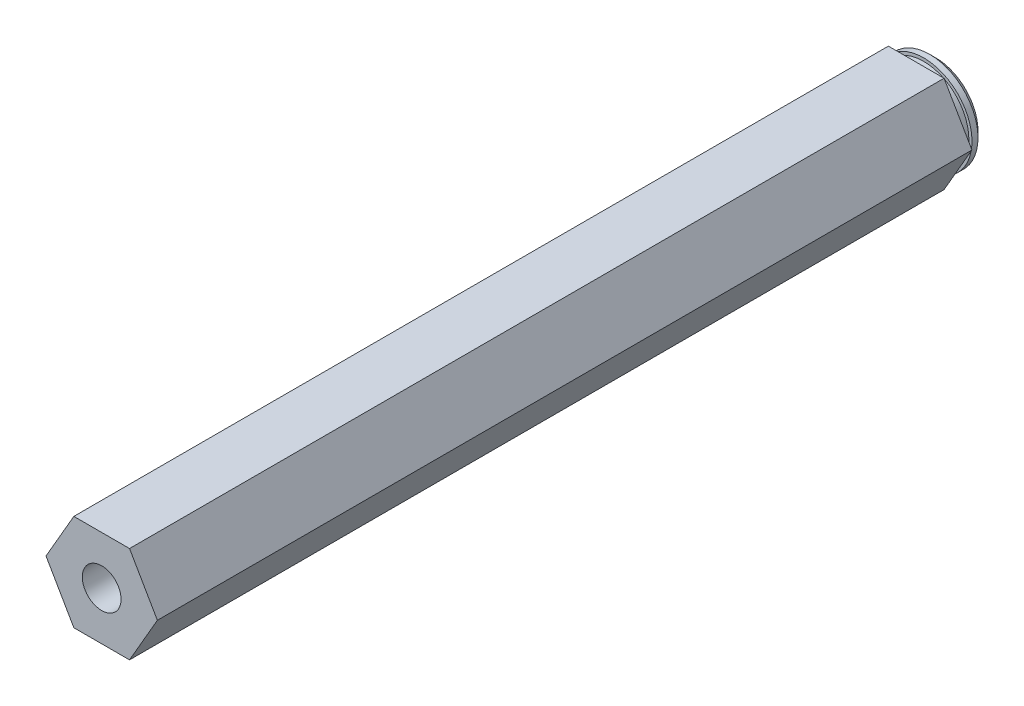
ISO-10303-21;
HEADER;
FILE_DESCRIPTION(('STEP AP214'),'2;1');
FILE_NAME('part.step','',(''),(''),'','','');
FILE_SCHEMA(('AUTOMOTIVE_DESIGN { 1 0 10303 214 1 1 1 1 }'));
ENDSEC;
DATA;
#1=APPLICATION_CONTEXT('core data for automotive mechanical design processes');
#2=APPLICATION_PROTOCOL_DEFINITION('international standard','automotive_design',2000,#1);
#3=PRODUCT_CONTEXT('',#1,'mechanical');
#4=PRODUCT('Part','Part','',(#3));
#5=PRODUCT_RELATED_PRODUCT_CATEGORY('part','',(#4));
#6=PRODUCT_DEFINITION_FORMATION('','',#4);
#7=PRODUCT_DEFINITION_CONTEXT('part definition',#1,'design');
#8=PRODUCT_DEFINITION('design','',#6,#7);
#9=PRODUCT_DEFINITION_SHAPE('','',#8);
#10=(LENGTH_UNIT() NAMED_UNIT(*) SI_UNIT(.MILLI.,.METRE.));
#11=(NAMED_UNIT(*) PLANE_ANGLE_UNIT() SI_UNIT($,.RADIAN.));
#12=(NAMED_UNIT(*) SI_UNIT($,.STERADIAN.) SOLID_ANGLE_UNIT());
#13=UNCERTAINTY_MEASURE_WITH_UNIT(LENGTH_MEASURE(1.E-05),#10,'distance_accuracy_value','');
#14=(GEOMETRIC_REPRESENTATION_CONTEXT(3) GLOBAL_UNCERTAINTY_ASSIGNED_CONTEXT((#13)) GLOBAL_UNIT_ASSIGNED_CONTEXT((#10,
#11,#12)) REPRESENTATION_CONTEXT('',''));
#15=CARTESIAN_POINT('',(0.,0.,0.));
#16=DIRECTION('',(0.,0.,1.));
#17=DIRECTION('',(1.,0.,0.));
#18=AXIS2_PLACEMENT_3D('',#15,#16,#17);
#19=CARTESIAN_POINT('',(0.,0.,-38.1000000000427));
#20=DIRECTION('',(0.,0.,-1.));
#21=DIRECTION('',(-1.,0.,0.));
#22=AXIS2_PLACEMENT_3D('',#19,#20,#21);
#23=CONICAL_SURFACE('',#22,3.1877000000691,1.02974425866953);
#24=CARTESIAN_POINT('',(0.,0.,-36.1846366047303));
#25=VERTEX_POINT('',#24);
#26=VERTEX_LOOP('',#25);
#27=FACE_BOUND('',#26,.T.);
#28=CARTESIAN_POINT('',(-1.66004709978296E-13,1.11022302462516E-13,-38.0999999999994));
#29=DIRECTION('',(0.,0.,-1.));
#30=DIRECTION('',(-1.,0.,0.));
#31=AXIS2_PLACEMENT_3D('',#28,#29,#30);
#32=CIRCLE('',#31,3.18769999999998);
#33=CARTESIAN_POINT('',(-3.18770000000015,1.11022302462516E-13,-38.0999999999994));
#34=VERTEX_POINT('',#33);
#35=EDGE_CURVE('E77',#34,#34,#32,.T.);
#36=ORIENTED_EDGE('',*,*,#35,.T.);
#37=EDGE_LOOP('',(#36));
#38=FACE_BOUND('',#37,.T.);
#39=ADVANCED_FACE('F17',(#27,#38),#23,.F.);
#40=CARTESIAN_POINT('',(-1.66533453693773E-13,1.11022302462516E-13,-63.4999999999992));
#41=DIRECTION('',(0.,0.,-1.));
#42=DIRECTION('',(-1.,0.,0.));
#43=AXIS2_PLACEMENT_3D('',#40,#41,#42);
#44=CYLINDRICAL_SURFACE('',#43,3.18769999999998);
#45=ORIENTED_EDGE('',*,*,#35,.F.);
#46=EDGE_LOOP('',(#45));
#47=FACE_BOUND('',#46,.T.);
#48=CARTESIAN_POINT('',(-1.66533453693773E-13,1.11022302462516E-13,-63.4999999999992));
#49=DIRECTION('',(0.,0.,-1.));
#50=DIRECTION('',(-1.,0.,0.));
#51=AXIS2_PLACEMENT_3D('',#48,#49,#50);
#52=CIRCLE('',#51,3.18769999999998);
#53=CARTESIAN_POINT('',(-3.18770000000015,1.11022302462516E-13,-63.4999999999992));
#54=VERTEX_POINT('',#53);
#55=EDGE_CURVE('E20',#54,#54,#52,.T.);
#56=ORIENTED_EDGE('',*,*,#55,.T.);
#57=EDGE_LOOP('',(#56));
#58=FACE_BOUND('',#57,.T.);
#59=ADVANCED_FACE('F74',(#47,#58),#44,.F.);
#60=CARTESIAN_POINT('',(-1.66533453693773E-13,1.11022302462516E-13,-63.4999999999992));
#61=DIRECTION('',(0.,0.,1.));
#62=DIRECTION('',(1.,0.,0.));
#63=AXIS2_PLACEMENT_3D('',#60,#61,#62);
#64=PLANE('',#63);
#65=ORIENTED_EDGE('',*,*,#55,.F.);
#66=EDGE_LOOP('',(#65));
#67=FACE_BOUND('',#66,.T.);
#68=CARTESIAN_POINT('',(-1.66533453693773E-13,1.11022302462516E-13,-63.4999999999764));
#69=DIRECTION('',(0.,0.,1.));
#70=DIRECTION('',(1.,0.,0.));
#71=AXIS2_PLACEMENT_3D('',#68,#69,#70);
#72=CIRCLE('',#71,5.55624999998389);
#73=CARTESIAN_POINT('',(5.55624999998372,1.11022302462516E-13,-63.4999999999764));
#74=VERTEX_POINT('',#73);
#75=EDGE_CURVE('E81',#74,#74,#72,.T.);
#76=ORIENTED_EDGE('',*,*,#75,.F.);
#77=EDGE_LOOP('',(#76));
#78=FACE_BOUND('',#77,.T.);
#79=ADVANCED_FACE('F113',(#67,#78),#64,.F.);
#80=CARTESIAN_POINT('',(-1.66533453693773E-13,1.11022302462516E-13,-62.7062500000761));
#81=DIRECTION('',(0.,0.,1.));
#82=DIRECTION('',(1.,0.,0.));
#83=AXIS2_PLACEMENT_3D('',#80,#81,#82);
#84=CONICAL_SURFACE('',#83,6.34999999994096,0.785398163433255);
#85=CARTESIAN_POINT('',(-1.11059446708528E-13,0.,-62.7062499999992));
#86=DIRECTION('',(0.,0.,-1.));
#87=DIRECTION('',(-1.,0.,0.));
#88=AXIS2_PLACEMENT_3D('',#85,#86,#87);
#89=CIRCLE('',#88,6.34999999999997);
#90=CARTESIAN_POINT('',(-6.35000000000008,0.,-62.7062499999992));
#91=VERTEX_POINT('',#90);
#92=EDGE_CURVE('E84',#91,#91,#89,.F.);
#93=ORIENTED_EDGE('',*,*,#92,.F.);
#94=EDGE_LOOP('',(#93));
#95=FACE_BOUND('',#94,.T.);
#96=ORIENTED_EDGE('',*,*,#75,.T.);
#97=EDGE_LOOP('',(#96));
#98=FACE_BOUND('',#97,.T.);
#99=ADVANCED_FACE('F111',(#95,#98),#84,.T.);
#100=CARTESIAN_POINT('',(-1.11022302462516E-13,0.,-60.9218999999992));
#101=DIRECTION('',(0.,0.,-1.));
#102=DIRECTION('',(-1.,0.,0.));
#103=AXIS2_PLACEMENT_3D('',#100,#101,#102);
#104=CYLINDRICAL_SURFACE('',#103,6.34999999999997);
#105=ORIENTED_EDGE('',*,*,#92,.T.);
#106=EDGE_LOOP('',(#105));
#107=FACE_BOUND('',#106,.T.);
#108=CARTESIAN_POINT('',(-1.11042923467419E-13,0.,-61.9124999999991));
#109=DIRECTION('',(0.,0.,-1.));
#110=DIRECTION('',(-1.,0.,0.));
#111=AXIS2_PLACEMENT_3D('',#108,#109,#110);
#112=CIRCLE('',#111,6.34999999999997);
#113=CARTESIAN_POINT('',(-6.35000000000008,0.,-61.9124999999991));
#114=VERTEX_POINT('',#113);
#115=EDGE_CURVE('E100',#114,#114,#112,.F.);
#116=ORIENTED_EDGE('',*,*,#115,.F.);
#117=EDGE_LOOP('',(#116));
#118=FACE_BOUND('',#117,.T.);
#119=ADVANCED_FACE('F108',(#107,#118),#104,.T.);
#120=CARTESIAN_POINT('',(0.,6.34999999999997,-61.9124999999992));
#121=DIRECTION('',(0.,0.,1.));
#122=DIRECTION('',(1.,0.,0.));
#123=AXIS2_PLACEMENT_3D('',#120,#121,#122);
#124=PLANE('',#123);
#125=CARTESIAN_POINT('',(0.,0.,-61.9124999999991));
#126=DIRECTION('',(0.,0.,1.));
#127=DIRECTION('',(1.,0.,0.));
#128=AXIS2_PLACEMENT_3D('',#125,#126,#127);
#129=CIRCLE('',#128,5.94359999999998);
#130=CARTESIAN_POINT('',(5.94359999999997,0.,-61.9124999999991));
#131=VERTEX_POINT('',#130);
#132=EDGE_CURVE('E96',#131,#131,#129,.T.);
#133=ORIENTED_EDGE('',*,*,#132,.F.);
#134=EDGE_LOOP('',(#133));
#135=FACE_BOUND('',#134,.T.);
#136=ORIENTED_EDGE('',*,*,#115,.T.);
#137=EDGE_LOOP('',(#136));
#138=FACE_BOUND('',#137,.T.);
#139=ADVANCED_FACE('F120',(#135,#138),#124,.T.);
#140=CARTESIAN_POINT('',(0.,0.,0.));
#141=DIRECTION('',(0.,0.,1.));
#142=DIRECTION('',(1.,0.,0.));
#143=AXIS2_PLACEMENT_3D('',#140,#141,#142);
#144=CONICAL_SURFACE('',#143,2.55270000002383,1.02974425868774);
#145=CARTESIAN_POINT('',(0.,0.,-1.53381690216747));
#146=VERTEX_POINT('',#145);
#147=VERTEX_LOOP('',#146);
#148=FACE_BOUND('',#147,.T.);
#149=CARTESIAN_POINT('',(0.,-1.38777878078145E-13,0.));
#150=DIRECTION('',(0.,0.,1.));
#151=DIRECTION('',(1.,0.,0.));
#152=AXIS2_PLACEMENT_3D('',#149,#150,#151);
#153=CIRCLE('',#152,2.55269999999998);
#154=CARTESIAN_POINT('',(2.55270000000006,-1.38777878078145E-13,0.));
#155=VERTEX_POINT('',#154);
#156=EDGE_CURVE('E99',#155,#155,#153,.T.);
#157=ORIENTED_EDGE('',*,*,#156,.T.);
#158=EDGE_LOOP('',(#157));
#159=FACE_BOUND('',#158,.T.);
#160=ADVANCED_FACE('F166',(#148,#159),#144,.F.);
#161=CARTESIAN_POINT('',(0.,0.,0.));
#162=DIRECTION('',(0.,0.,1.));
#163=DIRECTION('',(1.,0.,0.));
#164=AXIS2_PLACEMENT_3D('',#161,#162,#163);
#165=CYLINDRICAL_SURFACE('',#164,5.94359999999998);
#166=ORIENTED_EDGE('',*,*,#132,.T.);
#167=EDGE_LOOP('',(#166));
#168=FACE_BOUND('',#167,.T.);
#169=CARTESIAN_POINT('',(0.,0.,-60.9218999999992));
#170=DIRECTION('',(0.,0.,1.));
#171=DIRECTION('',(1.,0.,0.));
#172=AXIS2_PLACEMENT_3D('',#169,#170,#171);
#173=CIRCLE('',#172,5.94359999999998);
#174=CARTESIAN_POINT('',(5.94359999999997,0.,-60.9218999999992));
#175=VERTEX_POINT('',#174);
#176=EDGE_CURVE('E91',#175,#175,#173,.T.);
#177=ORIENTED_EDGE('',*,*,#176,.F.);
#178=EDGE_LOOP('',(#177));
#179=FACE_BOUND('',#178,.T.);
#180=ADVANCED_FACE('F162',(#168,#179),#165,.T.);
#181=CARTESIAN_POINT('',(0.,-1.38777878078145E-13,63.4999999999999));
#182=DIRECTION('',(0.,0.,1.));
#183=DIRECTION('',(1.,0.,0.));
#184=AXIS2_PLACEMENT_3D('',#181,#182,#183);
#185=CYLINDRICAL_SURFACE('',#184,2.55269999999998);
#186=ORIENTED_EDGE('',*,*,#156,.F.);
#187=EDGE_LOOP('',(#186));
#188=FACE_BOUND('',#187,.T.);
#189=CARTESIAN_POINT('',(0.,-1.38777878078145E-13,46.3296));
#190=DIRECTION('',(0.,0.,1.));
#191=DIRECTION('',(1.,0.,0.));
#192=AXIS2_PLACEMENT_3D('',#189,#190,#191);
#193=CIRCLE('',#192,2.55269999999998);
#194=CARTESIAN_POINT('',(2.55270000000007,-1.38777878078145E-13,46.3296));
#195=VERTEX_POINT('',#194);
#196=EDGE_CURVE('E86',#195,#195,#193,.F.);
#197=ORIENTED_EDGE('',*,*,#196,.F.);
#198=EDGE_LOOP('',(#197));
#199=FACE_BOUND('',#198,.T.);
#200=ADVANCED_FACE('F158',(#188,#199),#185,.F.);
#201=CARTESIAN_POINT('',(7.33234841870831,-1.11022302462516E-13,63.5));
#202=DIRECTION('',(-0.866025403784439,-0.499999999999999,0.));
#203=DIRECTION('',(0.499999999999999,-0.866025403784439,0.));
#204=AXIS2_PLACEMENT_3D('',#201,#202,#203);
#205=PLANE('',#204);
#206=DIRECTION('',(0.,0.,1.));
#207=VECTOR('',#206,1.);
#208=CARTESIAN_POINT('',(7.33234841870825,0.,63.5));
#209=LINE('',#208,#207);
#210=CARTESIAN_POINT('',(7.33234841870824,0.,46.3295999999999));
#211=VERTEX_POINT('',#210);
#212=CARTESIAN_POINT('',(7.33234841870825,0.,-60.9218999999992));
#213=VERTEX_POINT('',#212);
#214=EDGE_CURVE('E201',#211,#213,#209,.F.);
#215=ORIENTED_EDGE('',*,*,#214,.T.);
#216=DIRECTION('',(0.499999999999991,-0.866025403784444,0.));
#217=VECTOR('',#216,1.);
#218=CARTESIAN_POINT('',(3.66617420935425,6.34999999999994,-60.9218999999992));
#219=LINE('',#218,#217);
#220=CARTESIAN_POINT('',(3.66617420935422,6.34999999999991,-60.9218999999992));
#221=VERTEX_POINT('',#220);
#222=EDGE_CURVE('E197',#221,#213,#219,.T.);
#223=ORIENTED_EDGE('',*,*,#222,.F.);
#224=DIRECTION('',(0.,0.,1.));
#225=VECTOR('',#224,1.);
#226=CARTESIAN_POINT('',(3.66617420935425,6.34999999999986,63.4999999999999));
#227=LINE('',#226,#225);
#228=CARTESIAN_POINT('',(3.66617420935423,6.34999999999994,46.3295999999999));
#229=VERTEX_POINT('',#228);
#230=EDGE_CURVE('E207',#221,#229,#227,.T.);
#231=ORIENTED_EDGE('',*,*,#230,.T.);
#232=DIRECTION('',(-0.499999999999976,0.866025403784452,0.));
#233=VECTOR('',#232,1.);
#234=CARTESIAN_POINT('',(7.33234841870822,0.,46.3296));
#235=LINE('',#234,#233);
#236=EDGE_CURVE('E218',#211,#229,#235,.T.);
#237=ORIENTED_EDGE('',*,*,#236,.F.);
#238=EDGE_LOOP('',(#215,#223,#231,#237));
#239=FACE_BOUND('',#238,.T.);
#240=ADVANCED_FACE('F154',(#239),#205,.F.);
#241=CARTESIAN_POINT('',(3.66617420935418,6.34999999999986,63.4999999999999));
#242=DIRECTION('',(0.,-1.,0.));
#243=DIRECTION('',(1.,0.,0.));
#244=AXIS2_PLACEMENT_3D('',#241,#242,#243);
#245=PLANE('',#244);
#246=ORIENTED_EDGE('',*,*,#230,.F.);
#247=DIRECTION('',(-1.,0.,0.));
#248=VECTOR('',#247,1.);
#249=CARTESIAN_POINT('',(-1.11022302462516E-13,6.34999999999999,-60.9218999999992));
#250=LINE('',#249,#248);
#251=CARTESIAN_POINT('',(-3.66617420935413,6.34999999999992,-60.9218999999992));
#252=VERTEX_POINT('',#251);
#253=EDGE_CURVE('E199',#252,#221,#250,.F.);
#254=ORIENTED_EDGE('',*,*,#253,.F.);
#255=DIRECTION('',(0.,0.,1.));
#256=VECTOR('',#255,1.);
#257=CARTESIAN_POINT('',(-3.66617420935409,6.34999999999997,63.4999999999999));
#258=LINE('',#257,#256);
#259=CARTESIAN_POINT('',(-3.66617420935413,6.34999999999993,46.3295999999999));
#260=VERTEX_POINT('',#259);
#261=EDGE_CURVE('E204',#252,#260,#258,.T.);
#262=ORIENTED_EDGE('',*,*,#261,.T.);
#263=DIRECTION('',(1.,0.,0.));
#264=VECTOR('',#263,1.);
#265=CARTESIAN_POINT('',(0.,6.35000000000002,46.3296));
#266=LINE('',#265,#264);
#267=EDGE_CURVE('E219',#229,#260,#266,.F.);
#268=ORIENTED_EDGE('',*,*,#267,.F.);
#269=EDGE_LOOP('',(#246,#254,#262,#268));
#270=FACE_BOUND('',#269,.T.);
#271=ADVANCED_FACE('F150',(#270),#245,.F.);
#272=CARTESIAN_POINT('',(-3.66617420935414,6.34999999999988,63.4999999999999));
#273=DIRECTION('',(0.866025403784439,-0.499999999999999,0.));
#274=DIRECTION('',(0.499999999999999,0.866025403784439,0.));
#275=AXIS2_PLACEMENT_3D('',#272,#273,#274);
#276=PLANE('',#275);
#277=ORIENTED_EDGE('',*,*,#261,.F.);
#278=DIRECTION('',(0.500000000000012,0.866025403784432,0.));
#279=VECTOR('',#278,1.);
#280=CARTESIAN_POINT('',(-7.33234841870839,0.,-60.9218999999992));
#281=LINE('',#280,#279);
#282=CARTESIAN_POINT('',(-7.33234841870833,0.,-60.9218999999992));
#283=VERTEX_POINT('',#282);
#284=EDGE_CURVE('E95',#283,#252,#281,.T.);
#285=ORIENTED_EDGE('',*,*,#284,.F.);
#286=DIRECTION('',(0.,0.,1.));
#287=VECTOR('',#286,1.);
#288=CARTESIAN_POINT('',(-7.33234841870833,0.,63.5));
#289=LINE('',#288,#287);
#290=CARTESIAN_POINT('',(-7.33234841870826,0.,46.3295999999999));
#291=VERTEX_POINT('',#290);
#292=EDGE_CURVE('E90',#283,#291,#289,.T.);
#293=ORIENTED_EDGE('',*,*,#292,.T.);
#294=DIRECTION('',(-0.499999999999999,-0.866025403784439,0.));
#295=VECTOR('',#294,1.);
#296=CARTESIAN_POINT('',(-3.66617420935414,6.35000000000005,46.3296));
#297=LINE('',#296,#295);
#298=EDGE_CURVE('E221',#260,#291,#297,.T.);
#299=ORIENTED_EDGE('',*,*,#298,.F.);
#300=EDGE_LOOP('',(#277,#285,#293,#299));
#301=FACE_BOUND('',#300,.T.);
#302=ADVANCED_FACE('F146',(#301),#276,.F.);
#303=CARTESIAN_POINT('',(3.66617420935411,-6.35000000000005,63.5));
#304=DIRECTION('',(-0.866025403784439,0.499999999999999,0.));
#305=DIRECTION('',(-0.499999999999999,-0.866025403784439,0.));
#306=AXIS2_PLACEMENT_3D('',#303,#304,#305);
#307=PLANE('',#306);
#308=DIRECTION('',(0.,0.,1.));
#309=VECTOR('',#308,1.);
#310=CARTESIAN_POINT('',(3.66617420935411,-6.35000000000002,63.5));
#311=LINE('',#310,#309);
#312=CARTESIAN_POINT('',(3.66617420935409,-6.35000000000003,46.3295999999999));
#313=VERTEX_POINT('',#312);
#314=CARTESIAN_POINT('',(3.66617420935406,-6.34999999999998,-60.9218999999992));
#315=VERTEX_POINT('',#314);
#316=EDGE_CURVE('E230',#313,#315,#311,.F.);
#317=ORIENTED_EDGE('',*,*,#316,.T.);
#318=DIRECTION('',(-0.500000000000033,-0.86602540378442,0.));
#319=VECTOR('',#318,1.);
#320=CARTESIAN_POINT('',(7.33234841870825,0.,-60.9218999999992));
#321=LINE('',#320,#319);
#322=EDGE_CURVE('E195',#213,#315,#321,.T.);
#323=ORIENTED_EDGE('',*,*,#322,.F.);
#324=ORIENTED_EDGE('',*,*,#214,.F.);
#325=DIRECTION('',(0.500000000000007,0.866025403784434,0.));
#326=VECTOR('',#325,1.);
#327=CARTESIAN_POINT('',(3.66617420935411,-6.34999999999986,46.3296));
#328=LINE('',#327,#326);
#329=EDGE_CURVE('E89',#313,#211,#328,.T.);
#330=ORIENTED_EDGE('',*,*,#329,.F.);
#331=EDGE_LOOP('',(#317,#323,#324,#330));
#332=FACE_BOUND('',#331,.T.);
#333=ADVANCED_FACE('F142',(#332),#307,.F.);
#334=CARTESIAN_POINT('',(-1.11022302462516E-13,0.,-60.9218999999992));
#335=DIRECTION('',(0.,0.,-1.));
#336=DIRECTION('',(-1.,0.,0.));
#337=AXIS2_PLACEMENT_3D('',#334,#335,#336);
#338=PLANE('',#337);
#339=ORIENTED_EDGE('',*,*,#176,.T.);
#340=EDGE_LOOP('',(#339));
#341=FACE_BOUND('',#340,.T.);
#342=DIRECTION('',(-0.5,0.866025403784439,0.));
#343=VECTOR('',#342,1.);
#344=CARTESIAN_POINT('',(-7.3323484187083,0.,-60.9218999999991));
#345=LINE('',#344,#343);
#346=CARTESIAN_POINT('',(-3.66617420935438,-6.34999999999995,-60.9218999999992));
#347=VERTEX_POINT('',#346);
#348=EDGE_CURVE('E94',#347,#283,#345,.T.);
#349=ORIENTED_EDGE('',*,*,#348,.T.);
#350=ORIENTED_EDGE('',*,*,#284,.T.);
#351=ORIENTED_EDGE('',*,*,#253,.T.);
#352=ORIENTED_EDGE('',*,*,#222,.T.);
#353=ORIENTED_EDGE('',*,*,#322,.T.);
#354=DIRECTION('',(1.,0.,0.));
#355=VECTOR('',#354,1.);
#356=CARTESIAN_POINT('',(-3.66617420935425,-6.34999999999999,-60.9218999999992));
#357=LINE('',#356,#355);
#358=EDGE_CURVE('E186',#315,#347,#357,.F.);
#359=ORIENTED_EDGE('',*,*,#358,.T.);
#360=EDGE_LOOP('',(#349,#350,#351,#352,#353,#359));
#361=FACE_BOUND('',#360,.T.);
#362=ADVANCED_FACE('F138',(#341,#361),#338,.T.);
#363=CARTESIAN_POINT('',(-7.33234841870831,0.,63.5));
#364=DIRECTION('',(0.866025403784439,0.5,0.));
#365=DIRECTION('',(-0.5,0.866025403784439,0.));
#366=AXIS2_PLACEMENT_3D('',#363,#364,#365);
#367=PLANE('',#366);
#368=ORIENTED_EDGE('',*,*,#292,.F.);
#369=ORIENTED_EDGE('',*,*,#348,.F.);
#370=DIRECTION('',(0.,0.,1.));
#371=VECTOR('',#370,1.);
#372=CARTESIAN_POINT('',(-3.66617420935444,-6.35000000000002,63.5));
#373=LINE('',#372,#371);
#374=CARTESIAN_POINT('',(-3.66617420935426,-6.35000000000003,46.3295999999999));
#375=VERTEX_POINT('',#374);
#376=EDGE_CURVE('E26',#347,#375,#373,.T.);
#377=ORIENTED_EDGE('',*,*,#376,.T.);
#378=DIRECTION('',(0.49999999999999,-0.866025403784444,0.));
#379=VECTOR('',#378,1.);
#380=CARTESIAN_POINT('',(-7.33234841870828,0.,46.3296));
#381=LINE('',#380,#379);
#382=EDGE_CURVE('E34',#291,#375,#381,.T.);
#383=ORIENTED_EDGE('',*,*,#382,.F.);
#384=EDGE_LOOP('',(#368,#369,#377,#383));
#385=FACE_BOUND('',#384,.T.);
#386=ADVANCED_FACE('F132',(#385),#367,.F.);
#387=CARTESIAN_POINT('',(0.,1.38777878078145E-13,46.3296));
#388=DIRECTION('',(0.,0.,1.));
#389=DIRECTION('',(1.,0.,0.));
#390=AXIS2_PLACEMENT_3D('',#387,#388,#389);
#391=PLANE('',#390);
#392=ORIENTED_EDGE('',*,*,#382,.T.);
#393=DIRECTION('',(1.,0.,0.));
#394=VECTOR('',#393,1.);
#395=CARTESIAN_POINT('',(-3.66617420935425,-6.35000000000002,46.3295999999998));
#396=LINE('',#395,#394);
#397=EDGE_CURVE('E11',#375,#313,#396,.T.);
#398=ORIENTED_EDGE('',*,*,#397,.T.);
#399=ORIENTED_EDGE('',*,*,#329,.T.);
#400=ORIENTED_EDGE('',*,*,#236,.T.);
#401=ORIENTED_EDGE('',*,*,#267,.T.);
#402=ORIENTED_EDGE('',*,*,#298,.T.);
#403=EDGE_LOOP('',(#392,#398,#399,#400,#401,#402));
#404=FACE_BOUND('',#403,.T.);
#405=ORIENTED_EDGE('',*,*,#196,.T.);
#406=EDGE_LOOP('',(#405));
#407=FACE_BOUND('',#406,.T.);
#408=ADVANCED_FACE('F126',(#404,#407),#391,.T.);
#409=CARTESIAN_POINT('',(-3.66617420935425,-6.35000000000002,63.5));
#410=DIRECTION('',(0.,1.,0.));
#411=DIRECTION('',(0.,0.,1.));
#412=AXIS2_PLACEMENT_3D('',#409,#410,#411);
#413=PLANE('',#412);
#414=ORIENTED_EDGE('',*,*,#376,.F.);
#415=ORIENTED_EDGE('',*,*,#358,.F.);
#416=ORIENTED_EDGE('',*,*,#316,.F.);
#417=ORIENTED_EDGE('',*,*,#397,.F.);
#418=EDGE_LOOP('',(#414,#415,#416,#417));
#419=FACE_BOUND('',#418,.T.);
#420=ADVANCED_FACE('F124',(#419),#413,.F.);
#421=CLOSED_SHELL('',(#39,#59,#79,#99,#119,#139,#160,#180,#200,#240,#271,#302,#333,#362,#386,
#408,#420));
#422=MANIFOLD_SOLID_BREP('B1',#421);
#423=ADVANCED_BREP_SHAPE_REPRESENTATION('',(#18,#422),#14);
#424=SHAPE_DEFINITION_REPRESENTATION(#9,#423);
ENDSEC;
END-ISO-10303-21;
